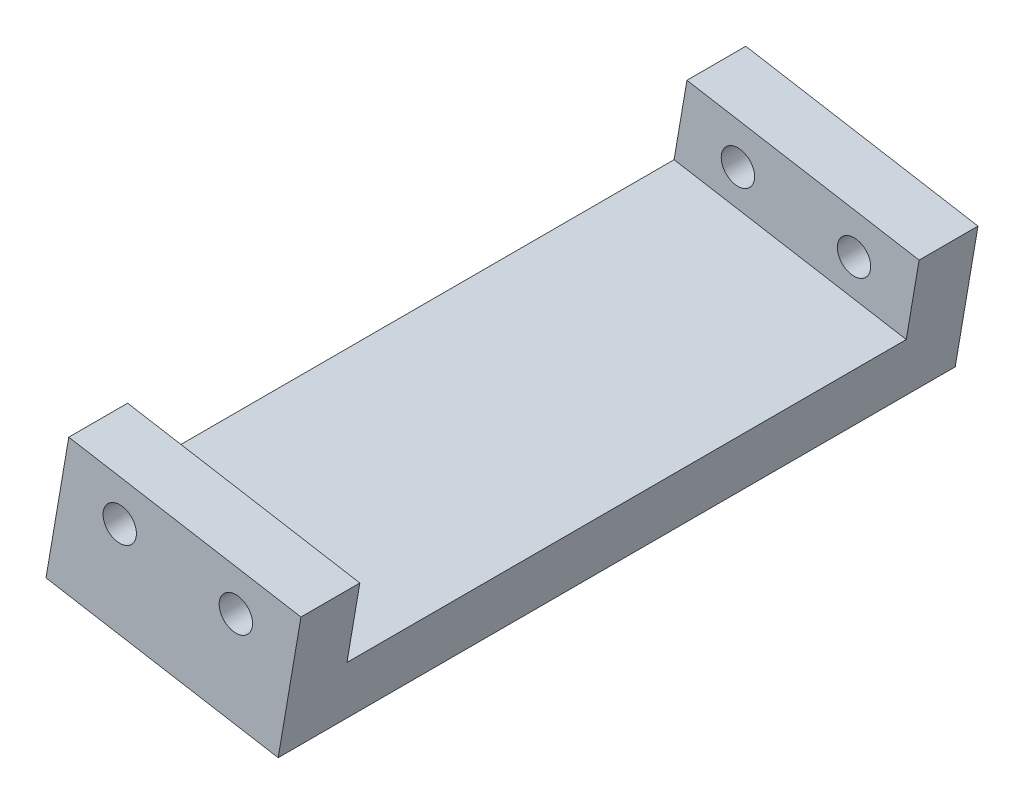
ISO-10303-21;
HEADER;
FILE_DESCRIPTION(('STEP AP214'),'2;1');
FILE_NAME('part.step','',(''),(''),'','','');
FILE_SCHEMA(('AUTOMOTIVE_DESIGN { 1 0 10303 214 1 1 1 1 }'));
ENDSEC;
DATA;
#1=APPLICATION_CONTEXT('core data for automotive mechanical design processes');
#2=APPLICATION_PROTOCOL_DEFINITION('international standard','automotive_design',2000,#1);
#3=PRODUCT_CONTEXT('',#1,'mechanical');
#4=PRODUCT('Part','Part','',(#3));
#5=PRODUCT_RELATED_PRODUCT_CATEGORY('part','',(#4));
#6=PRODUCT_DEFINITION_FORMATION('','',#4);
#7=PRODUCT_DEFINITION_CONTEXT('part definition',#1,'design');
#8=PRODUCT_DEFINITION('design','',#6,#7);
#9=PRODUCT_DEFINITION_SHAPE('','',#8);
#10=(LENGTH_UNIT() NAMED_UNIT(*) SI_UNIT(.MILLI.,.METRE.));
#11=(NAMED_UNIT(*) PLANE_ANGLE_UNIT() SI_UNIT($,.RADIAN.));
#12=(NAMED_UNIT(*) SI_UNIT($,.STERADIAN.) SOLID_ANGLE_UNIT());
#13=UNCERTAINTY_MEASURE_WITH_UNIT(LENGTH_MEASURE(1.E-05),#10,'distance_accuracy_value','');
#14=(GEOMETRIC_REPRESENTATION_CONTEXT(3) GLOBAL_UNCERTAINTY_ASSIGNED_CONTEXT((#13)) GLOBAL_UNIT_ASSIGNED_CONTEXT((#10,
#11,#12)) REPRESENTATION_CONTEXT('',''));
#15=CARTESIAN_POINT('',(0.,0.,0.));
#16=DIRECTION('',(0.,0.,1.));
#17=DIRECTION('',(1.,0.,0.));
#18=AXIS2_PLACEMENT_3D('',#15,#16,#17);
#19=CARTESIAN_POINT('',(8.64604729688934,50.6257862654873,100.374266960868));
#20=DIRECTION('',(-0.16834603852191,-0.985727960095471,0.));
#21=DIRECTION('',(0.985727960095472,-0.16834603852191,0.));
#22=AXIS2_PLACEMENT_3D('',#19,#20,#21);
#23=PLANE('',#22);
#24=DIRECTION('',(0.,0.,-1.));
#25=VECTOR('',#24,1.);
#26=CARTESIAN_POINT('',(-16.027859429322,54.8396816000728,100.374266960868));
#27=LINE('',#26,#25);
#28=CARTESIAN_POINT('',(-16.027859429322,54.8396816000728,6.));
#29=VERTEX_POINT('',#28);
#30=CARTESIAN_POINT('',(-16.027859429322,54.8396816000728,0.));
#31=VERTEX_POINT('',#30);
#32=EDGE_CURVE('E166',#29,#31,#27,.T.);
#33=ORIENTED_EDGE('',*,*,#32,.F.);
#34=DIRECTION('',(-0.985727960095472,0.168346038521909,0.));
#35=VECTOR('',#34,1.);
#36=CARTESIAN_POINT('',(64.3225320513247,41.1171631699966,6.));
#37=LINE('',#36,#35);
#38=CARTESIAN_POINT('',(7.62961161296931,50.799376675547,6.));
#39=VERTEX_POINT('',#38);
#40=EDGE_CURVE('E123',#39,#29,#37,.T.);
#41=ORIENTED_EDGE('',*,*,#40,.F.);
#42=DIRECTION('',(0.,0.,-1.));
#43=VECTOR('',#42,1.);
#44=CARTESIAN_POINT('',(7.62961161296932,50.7993766755469,100.374266960868));
#45=LINE('',#44,#43);
#46=CARTESIAN_POINT('',(7.62961161296932,50.7993766755469,0.));
#47=VERTEX_POINT('',#46);
#48=EDGE_CURVE('E159',#39,#47,#45,.T.);
#49=ORIENTED_EDGE('',*,*,#48,.T.);
#50=DIRECTION('',(-0.985727960095472,0.16834603852191,0.));
#51=VECTOR('',#50,1.);
#52=CARTESIAN_POINT('',(8.64604729688934,50.6257862654873,0.));
#53=LINE('',#52,#51);
#54=EDGE_CURVE('E158',#47,#31,#53,.T.);
#55=ORIENTED_EDGE('',*,*,#54,.T.);
#56=EDGE_LOOP('',(#33,#41,#49,#55));
#57=FACE_BOUND('',#56,.T.);
#58=ADVANCED_FACE('F20',(#57),#23,.F.);
#59=CARTESIAN_POINT('',(-14.0958148419506,-5.1292355108764,68.985642121371));
#60=DIRECTION('',(0.,0.,1.));
#61=DIRECTION('',(1.,0.,0.));
#62=AXIS2_PLACEMENT_3D('',#59,#60,#61);
#63=PLANE('',#62);
#64=CARTESIAN_POINT('',(0.996801969378838,47.7594817694186,68.985642121371));
#65=DIRECTION('',(0.,0.,-1.));
#66=DIRECTION('',(-1.,0.,0.));
#67=AXIS2_PLACEMENT_3D('',#64,#65,#66);
#68=CIRCLE('',#67,1.7);
#69=CARTESIAN_POINT('',(-0.703198030621162,47.7594817694186,68.985642121371));
#70=VERTEX_POINT('',#69);
#71=EDGE_CURVE('E207',#70,#70,#68,.T.);
#72=ORIENTED_EDGE('',*,*,#71,.T.);
#73=EDGE_LOOP('',(#72));
#74=FACE_BOUND('',#73,.T.);
#75=CARTESIAN_POINT('',(-10.8329073340211,49.7739240736439,68.985642121371));
#76=DIRECTION('',(0.,0.,-1.));
#77=DIRECTION('',(-1.,0.,0.));
#78=AXIS2_PLACEMENT_3D('',#75,#76,#77);
#79=CIRCLE('',#78,1.7);
#80=CARTESIAN_POINT('',(-12.5329073340211,49.7739240736439,68.985642121371));
#81=VERTEX_POINT('',#80);
#82=EDGE_CURVE('E143',#81,#81,#79,.T.);
#83=ORIENTED_EDGE('',*,*,#82,.T.);
#84=EDGE_LOOP('',(#83));
#85=FACE_BOUND('',#84,.T.);
#86=DIRECTION('',(-0.985727960095472,0.168346038521909,0.));
#87=VECTOR('',#86,1.);
#88=CARTESIAN_POINT('',(6.32688085495981,37.0462139393613,68.985642121371));
#89=LINE('',#88,#87);
#90=CARTESIAN_POINT('',(5.31044517103981,37.219804349421,68.985642121371));
#91=VERTEX_POINT('',#90);
#92=CARTESIAN_POINT('',(-18.3470258712515,41.2601092739468,68.985642121371));
#93=VERTEX_POINT('',#92);
#94=EDGE_CURVE('E69',#91,#93,#89,.T.);
#95=ORIENTED_EDGE('',*,*,#94,.F.);
#96=DIRECTION('',(0.168346038521909,0.985727960095472,0.));
#97=VECTOR('',#96,1.);
#98=CARTESIAN_POINT('',(-1.01643568391999,0.173590410059654,68.985642121371));
#99=LINE('',#98,#97);
#100=CARTESIAN_POINT('',(7.62961161296932,50.7993766755469,68.985642121371));
#101=VERTEX_POINT('',#100);
#102=EDGE_CURVE('E128',#91,#101,#99,.T.);
#103=ORIENTED_EDGE('',*,*,#102,.T.);
#104=DIRECTION('',(-0.985727960095472,0.16834603852191,0.));
#105=VECTOR('',#104,1.);
#106=CARTESIAN_POINT('',(8.64604729688934,50.6257862654873,68.985642121371));
#107=LINE('',#106,#105);
#108=CARTESIAN_POINT('',(-16.027859429322,54.8396816000728,68.985642121371));
#109=VERTEX_POINT('',#108);
#110=EDGE_CURVE('E179',#101,#109,#107,.T.);
#111=ORIENTED_EDGE('',*,*,#110,.T.);
#112=DIRECTION('',(-0.168346038521909,-0.985727960095472,0.));
#113=VECTOR('',#112,1.);
#114=CARTESIAN_POINT('',(-24.6739067262113,4.21389533458548,68.985642121371));
#115=LINE('',#114,#113);
#116=EDGE_CURVE('E160',#109,#93,#115,.T.);
#117=ORIENTED_EDGE('',*,*,#116,.T.);
#118=EDGE_LOOP('',(#95,#103,#111,#117));
#119=FACE_BOUND('',#118,.T.);
#120=ADVANCED_FACE('F22',(#74,#85,#119),#63,.T.);
#121=CARTESIAN_POINT('',(0.,0.,0.));
#122=DIRECTION('',(0.,0.,1.));
#123=DIRECTION('',(1.,0.,0.));
#124=AXIS2_PLACEMENT_3D('',#121,#122,#123);
#125=PLANE('',#124);
#126=CARTESIAN_POINT('',(0.996801969378838,47.7594817694186,0.));
#127=DIRECTION('',(0.,0.,-1.));
#128=DIRECTION('',(-1.,0.,0.));
#129=AXIS2_PLACEMENT_3D('',#126,#127,#128);
#130=CIRCLE('',#129,1.7);
#131=CARTESIAN_POINT('',(-0.703198030621162,47.7594817694186,0.));
#132=VERTEX_POINT('',#131);
#133=EDGE_CURVE('E210',#132,#132,#130,.T.);
#134=ORIENTED_EDGE('',*,*,#133,.F.);
#135=EDGE_LOOP('',(#134));
#136=FACE_BOUND('',#135,.T.);
#137=CARTESIAN_POINT('',(-10.8329073340211,49.7739240736439,0.));
#138=DIRECTION('',(0.,0.,-1.));
#139=DIRECTION('',(-1.,0.,0.));
#140=AXIS2_PLACEMENT_3D('',#137,#138,#139);
#141=CIRCLE('',#140,1.7);
#142=CARTESIAN_POINT('',(-12.5329073340211,49.7739240736439,0.));
#143=VERTEX_POINT('',#142);
#144=EDGE_CURVE('E201',#143,#143,#141,.T.);
#145=ORIENTED_EDGE('',*,*,#144,.F.);
#146=EDGE_LOOP('',(#145));
#147=FACE_BOUND('',#146,.T.);
#148=DIRECTION('',(0.168346038521909,0.985727960095472,0.));
#149=VECTOR('',#148,1.);
#150=CARTESIAN_POINT('',(-1.01643568391999,0.173590410059654,0.));
#151=LINE('',#150,#149);
#152=CARTESIAN_POINT('',(5.31044517103981,37.219804349421,0.));
#153=VERTEX_POINT('',#152);
#154=EDGE_CURVE('E12',#153,#47,#151,.T.);
#155=ORIENTED_EDGE('',*,*,#154,.F.);
#156=DIRECTION('',(-0.985727960095472,0.168346038521909,0.));
#157=VECTOR('',#156,1.);
#158=CARTESIAN_POINT('',(6.32688085495981,37.0462139393613,0.));
#159=LINE('',#158,#157);
#160=CARTESIAN_POINT('',(-18.3470258712515,41.2601092739468,0.));
#161=VERTEX_POINT('',#160);
#162=EDGE_CURVE('E130',#153,#161,#159,.T.);
#163=ORIENTED_EDGE('',*,*,#162,.T.);
#164=DIRECTION('',(-0.168346038521909,-0.985727960095472,0.));
#165=VECTOR('',#164,1.);
#166=CARTESIAN_POINT('',(-24.6739067262113,4.21389533458548,0.));
#167=LINE('',#166,#165);
#168=EDGE_CURVE('E165',#31,#161,#167,.T.);
#169=ORIENTED_EDGE('',*,*,#168,.F.);
#170=ORIENTED_EDGE('',*,*,#54,.F.);
#171=EDGE_LOOP('',(#155,#163,#169,#170));
#172=FACE_BOUND('',#171,.T.);
#173=ADVANCED_FACE('F186',(#136,#147,#172),#125,.F.);
#174=CARTESIAN_POINT('',(6.32688085495981,37.0462139393613,100.374266960868));
#175=DIRECTION('',(-0.168346038521909,-0.985727960095472,0.));
#176=DIRECTION('',(0.985727960095472,-0.168346038521909,0.));
#177=AXIS2_PLACEMENT_3D('',#174,#175,#176);
#178=PLANE('',#177);
#179=DIRECTION('',(0.,0.,-1.));
#180=VECTOR('',#179,1.);
#181=CARTESIAN_POINT('',(5.31044517103981,37.219804349421,100.374266960868));
#182=LINE('',#181,#180);
#183=EDGE_CURVE('E29',#91,#153,#182,.T.);
#184=ORIENTED_EDGE('',*,*,#183,.F.);
#185=ORIENTED_EDGE('',*,*,#94,.T.);
#186=DIRECTION('',(0.,0.,-1.));
#187=VECTOR('',#186,1.);
#188=CARTESIAN_POINT('',(-18.3470258712515,41.2601092739468,100.374266960868));
#189=LINE('',#188,#187);
#190=EDGE_CURVE('E167',#93,#161,#189,.T.);
#191=ORIENTED_EDGE('',*,*,#190,.T.);
#192=ORIENTED_EDGE('',*,*,#162,.F.);
#193=EDGE_LOOP('',(#184,#185,#191,#192));
#194=FACE_BOUND('',#193,.T.);
#195=ADVANCED_FACE('F190',(#194),#178,.T.);
#196=CARTESIAN_POINT('',(-24.6739067262113,4.21389533458548,100.374266960868));
#197=DIRECTION('',(0.985727960095472,-0.168346038521909,0.));
#198=DIRECTION('',(0.168346038521909,0.985727960095472,0.));
#199=AXIS2_PLACEMENT_3D('',#196,#197,#198);
#200=PLANE('',#199);
#201=DIRECTION('',(0.,0.,1.));
#202=VECTOR('',#201,1.);
#203=CARTESIAN_POINT('',(-17.3369496401201,47.1744770345197,0.));
#204=LINE('',#203,#202);
#205=CARTESIAN_POINT('',(-17.3369496401201,47.1744770345197,6.));
#206=VERTEX_POINT('',#205);
#207=CARTESIAN_POINT('',(-17.3369496401201,47.1744770345197,62.985642121371));
#208=VERTEX_POINT('',#207);
#209=EDGE_CURVE('E104',#206,#208,#204,.T.);
#210=ORIENTED_EDGE('',*,*,#209,.F.);
#211=DIRECTION('',(-0.168346038521909,-0.985727960095472,0.));
#212=VECTOR('',#211,1.);
#213=CARTESIAN_POINT('',(-24.6739067262113,4.21389533458549,6.));
#214=LINE('',#213,#212);
#215=EDGE_CURVE('E101',#29,#206,#214,.T.);
#216=ORIENTED_EDGE('',*,*,#215,.F.);
#217=ORIENTED_EDGE('',*,*,#32,.T.);
#218=ORIENTED_EDGE('',*,*,#168,.T.);
#219=ORIENTED_EDGE('',*,*,#190,.F.);
#220=ORIENTED_EDGE('',*,*,#116,.F.);
#221=CARTESIAN_POINT('',(-16.027859429322,54.8396816000728,62.985642121371));
#222=VERTEX_POINT('',#221);
#223=EDGE_CURVE('E116',#109,#222,#27,.T.);
#224=ORIENTED_EDGE('',*,*,#223,.T.);
#225=DIRECTION('',(0.168346038521909,0.985727960095472,0.));
#226=VECTOR('',#225,1.);
#227=CARTESIAN_POINT('',(-24.6739067262113,4.21389533458549,62.985642121371));
#228=LINE('',#227,#226);
#229=EDGE_CURVE('E97',#208,#222,#228,.T.);
#230=ORIENTED_EDGE('',*,*,#229,.F.);
#231=EDGE_LOOP('',(#210,#216,#217,#218,#219,#220,#224,#230));
#232=FACE_BOUND('',#231,.T.);
#233=ADVANCED_FACE('F113',(#232),#200,.F.);
#234=CARTESIAN_POINT('',(7.62961161296932,50.7993766755469,62.985642121371));
#235=VERTEX_POINT('',#234);
#236=EDGE_CURVE('E153',#101,#235,#45,.T.);
#237=ORIENTED_EDGE('',*,*,#236,.T.);
#238=DIRECTION('',(-0.985727960095472,0.168346038521909,0.));
#239=VECTOR('',#238,1.);
#240=CARTESIAN_POINT('',(64.3225320513247,41.1171631699966,62.985642121371));
#241=LINE('',#240,#239);
#242=EDGE_CURVE('E37',#235,#222,#241,.T.);
#243=ORIENTED_EDGE('',*,*,#242,.T.);
#244=ORIENTED_EDGE('',*,*,#223,.F.);
#245=ORIENTED_EDGE('',*,*,#110,.F.);
#246=EDGE_LOOP('',(#237,#243,#244,#245));
#247=FACE_BOUND('',#246,.T.);
#248=ADVANCED_FACE('F247',(#247),#23,.F.);
#249=CARTESIAN_POINT('',(-1.01643568391999,0.173590410059654,100.374266960868));
#250=DIRECTION('',(-0.985727960095472,0.168346038521909,0.));
#251=DIRECTION('',(-0.168346038521909,-0.985727960095472,0.));
#252=AXIS2_PLACEMENT_3D('',#249,#250,#251);
#253=PLANE('',#252);
#254=ORIENTED_EDGE('',*,*,#48,.F.);
#255=DIRECTION('',(0.168346038521909,0.985727960095472,0.));
#256=VECTOR('',#255,1.);
#257=CARTESIAN_POINT('',(-1.01643568391999,0.173590410059646,6.));
#258=LINE('',#257,#256);
#259=CARTESIAN_POINT('',(6.32052140217128,43.1341721099938,6.));
#260=VERTEX_POINT('',#259);
#261=EDGE_CURVE('E77',#260,#39,#258,.T.);
#262=ORIENTED_EDGE('',*,*,#261,.F.);
#263=DIRECTION('',(0.,0.,-1.));
#264=VECTOR('',#263,1.);
#265=CARTESIAN_POINT('',(6.32052140217126,43.1341721099938,0.));
#266=LINE('',#265,#264);
#267=CARTESIAN_POINT('',(6.32052140217128,43.1341721099938,62.985642121371));
#268=VERTEX_POINT('',#267);
#269=EDGE_CURVE('E129',#268,#260,#266,.T.);
#270=ORIENTED_EDGE('',*,*,#269,.F.);
#271=DIRECTION('',(-0.168346038521909,-0.985727960095472,0.));
#272=VECTOR('',#271,1.);
#273=CARTESIAN_POINT('',(-1.01643568391999,0.173590410059646,62.985642121371));
#274=LINE('',#273,#272);
#275=EDGE_CURVE('E98',#235,#268,#274,.T.);
#276=ORIENTED_EDGE('',*,*,#275,.F.);
#277=ORIENTED_EDGE('',*,*,#236,.F.);
#278=ORIENTED_EDGE('',*,*,#102,.F.);
#279=ORIENTED_EDGE('',*,*,#183,.T.);
#280=ORIENTED_EDGE('',*,*,#154,.T.);
#281=EDGE_LOOP('',(#254,#262,#270,#276,#277,#278,#279,#280));
#282=FACE_BOUND('',#281,.T.);
#283=ADVANCED_FACE('F243',(#282),#253,.F.);
#284=CARTESIAN_POINT('',(63.0134418405267,33.4519586044435,0.));
#285=DIRECTION('',(-0.168346038521909,-0.985727960095472,0.));
#286=DIRECTION('',(0.985727960095472,-0.168346038521909,0.));
#287=AXIS2_PLACEMENT_3D('',#284,#285,#286);
#288=PLANE('',#287);
#289=ORIENTED_EDGE('',*,*,#269,.T.);
#290=DIRECTION('',(-0.985727960095472,0.168346038521909,0.));
#291=VECTOR('',#290,1.);
#292=CARTESIAN_POINT('',(63.0134418405267,33.4519586044435,6.));
#293=LINE('',#292,#291);
#294=EDGE_CURVE('E106',#260,#206,#293,.T.);
#295=ORIENTED_EDGE('',*,*,#294,.T.);
#296=ORIENTED_EDGE('',*,*,#209,.T.);
#297=DIRECTION('',(-0.985727960095472,0.168346038521909,0.));
#298=VECTOR('',#297,1.);
#299=CARTESIAN_POINT('',(63.0134418405267,33.4519586044435,62.985642121371));
#300=LINE('',#299,#298);
#301=EDGE_CURVE('E93',#268,#208,#300,.T.);
#302=ORIENTED_EDGE('',*,*,#301,.F.);
#303=EDGE_LOOP('',(#289,#295,#296,#302));
#304=FACE_BOUND('',#303,.T.);
#305=ADVANCED_FACE('F105',(#304),#288,.F.);
#306=CARTESIAN_POINT('',(55.6764847544354,-9.50862309549065,6.));
#307=DIRECTION('',(0.,0.,-1.));
#308=DIRECTION('',(0.,1.,0.));
#309=AXIS2_PLACEMENT_3D('',#306,#307,#308);
#310=PLANE('',#309);
#311=CARTESIAN_POINT('',(0.996801969378838,47.7594817694186,6.));
#312=DIRECTION('',(0.,0.,-1.));
#313=DIRECTION('',(0.,1.,0.));
#314=AXIS2_PLACEMENT_3D('',#311,#312,#313);
#315=CIRCLE('',#314,1.7);
#316=CARTESIAN_POINT('',(0.996801969378838,49.4594817694186,6.));
#317=VERTEX_POINT('',#316);
#318=EDGE_CURVE('E204',#317,#317,#315,.T.);
#319=ORIENTED_EDGE('',*,*,#318,.T.);
#320=EDGE_LOOP('',(#319));
#321=FACE_BOUND('',#320,.T.);
#322=CARTESIAN_POINT('',(-10.8329073340211,49.7739240736439,6.));
#323=DIRECTION('',(0.,0.,-1.));
#324=DIRECTION('',(0.,1.,0.));
#325=AXIS2_PLACEMENT_3D('',#322,#323,#324);
#326=CIRCLE('',#325,1.7);
#327=CARTESIAN_POINT('',(-10.8329073340211,51.4739240736439,6.));
#328=VERTEX_POINT('',#327);
#329=EDGE_CURVE('E110',#328,#328,#326,.T.);
#330=ORIENTED_EDGE('',*,*,#329,.T.);
#331=EDGE_LOOP('',(#330));
#332=FACE_BOUND('',#331,.T.);
#333=ORIENTED_EDGE('',*,*,#261,.T.);
#334=ORIENTED_EDGE('',*,*,#40,.T.);
#335=ORIENTED_EDGE('',*,*,#215,.T.);
#336=ORIENTED_EDGE('',*,*,#294,.F.);
#337=EDGE_LOOP('',(#333,#334,#335,#336));
#338=FACE_BOUND('',#337,.T.);
#339=ADVANCED_FACE('F231',(#321,#332,#338),#310,.F.);
#340=CARTESIAN_POINT('',(55.6764847544354,-9.50862309549065,62.985642121371));
#341=DIRECTION('',(0.,0.,1.));
#342=DIRECTION('',(1.,0.,0.));
#343=AXIS2_PLACEMENT_3D('',#340,#341,#342);
#344=PLANE('',#343);
#345=CARTESIAN_POINT('',(0.996801969378838,47.7594817694186,62.985642121371));
#346=DIRECTION('',(0.,0.,1.));
#347=DIRECTION('',(1.,0.,0.));
#348=AXIS2_PLACEMENT_3D('',#345,#346,#347);
#349=CIRCLE('',#348,1.7);
#350=CARTESIAN_POINT('',(2.69680196937884,47.7594817694186,62.985642121371));
#351=VERTEX_POINT('',#350);
#352=EDGE_CURVE('E24',#351,#351,#349,.T.);
#353=ORIENTED_EDGE('',*,*,#352,.T.);
#354=EDGE_LOOP('',(#353));
#355=FACE_BOUND('',#354,.T.);
#356=CARTESIAN_POINT('',(-10.8329073340211,49.7739240736439,62.985642121371));
#357=DIRECTION('',(0.,0.,1.));
#358=DIRECTION('',(1.,0.,0.));
#359=AXIS2_PLACEMENT_3D('',#356,#357,#358);
#360=CIRCLE('',#359,1.7);
#361=CARTESIAN_POINT('',(-9.13290733402112,49.7739240736439,62.985642121371));
#362=VERTEX_POINT('',#361);
#363=EDGE_CURVE('E142',#362,#362,#360,.T.);
#364=ORIENTED_EDGE('',*,*,#363,.T.);
#365=EDGE_LOOP('',(#364));
#366=FACE_BOUND('',#365,.T.);
#367=ORIENTED_EDGE('',*,*,#275,.T.);
#368=ORIENTED_EDGE('',*,*,#301,.T.);
#369=ORIENTED_EDGE('',*,*,#229,.T.);
#370=ORIENTED_EDGE('',*,*,#242,.F.);
#371=EDGE_LOOP('',(#367,#368,#369,#370));
#372=FACE_BOUND('',#371,.T.);
#373=ADVANCED_FACE('F95',(#355,#366,#372),#344,.F.);
#374=CARTESIAN_POINT('',(-10.8329073340211,49.7739240736439,0.));
#375=DIRECTION('',(0.,0.,-1.));
#376=DIRECTION('',(-1.,0.,0.));
#377=AXIS2_PLACEMENT_3D('',#374,#375,#376);
#378=CYLINDRICAL_SURFACE('',#377,1.7);
#379=ORIENTED_EDGE('',*,*,#82,.F.);
#380=EDGE_LOOP('',(#379));
#381=FACE_BOUND('',#380,.T.);
#382=ORIENTED_EDGE('',*,*,#363,.F.);
#383=EDGE_LOOP('',(#382));
#384=FACE_BOUND('',#383,.T.);
#385=ADVANCED_FACE('F227',(#381,#384),#378,.F.);
#386=ORIENTED_EDGE('',*,*,#144,.T.);
#387=EDGE_LOOP('',(#386));
#388=FACE_BOUND('',#387,.T.);
#389=ORIENTED_EDGE('',*,*,#329,.F.);
#390=EDGE_LOOP('',(#389));
#391=FACE_BOUND('',#390,.T.);
#392=ADVANCED_FACE('F223',(#388,#391),#378,.F.);
#393=CARTESIAN_POINT('',(0.996801969378838,47.7594817694186,0.));
#394=DIRECTION('',(0.,0.,-1.));
#395=DIRECTION('',(-1.,0.,0.));
#396=AXIS2_PLACEMENT_3D('',#393,#394,#395);
#397=CYLINDRICAL_SURFACE('',#396,1.7);
#398=ORIENTED_EDGE('',*,*,#71,.F.);
#399=EDGE_LOOP('',(#398));
#400=FACE_BOUND('',#399,.T.);
#401=ORIENTED_EDGE('',*,*,#352,.F.);
#402=EDGE_LOOP('',(#401));
#403=FACE_BOUND('',#402,.T.);
#404=ADVANCED_FACE('F226',(#400,#403),#397,.F.);
#405=ORIENTED_EDGE('',*,*,#133,.T.);
#406=EDGE_LOOP('',(#405));
#407=FACE_BOUND('',#406,.T.);
#408=ORIENTED_EDGE('',*,*,#318,.F.);
#409=EDGE_LOOP('',(#408));
#410=FACE_BOUND('',#409,.T.);
#411=ADVANCED_FACE('F215',(#407,#410),#397,.F.);
#412=CLOSED_SHELL('',(#58,#120,#173,#195,#233,#248,#283,#305,#339,#373,#385,#392,#404,#411));
#413=MANIFOLD_SOLID_BREP('B1',#412);
#414=ADVANCED_BREP_SHAPE_REPRESENTATION('',(#18,#413),#14);
#415=SHAPE_DEFINITION_REPRESENTATION(#9,#414);
ENDSEC;
END-ISO-10303-21;
